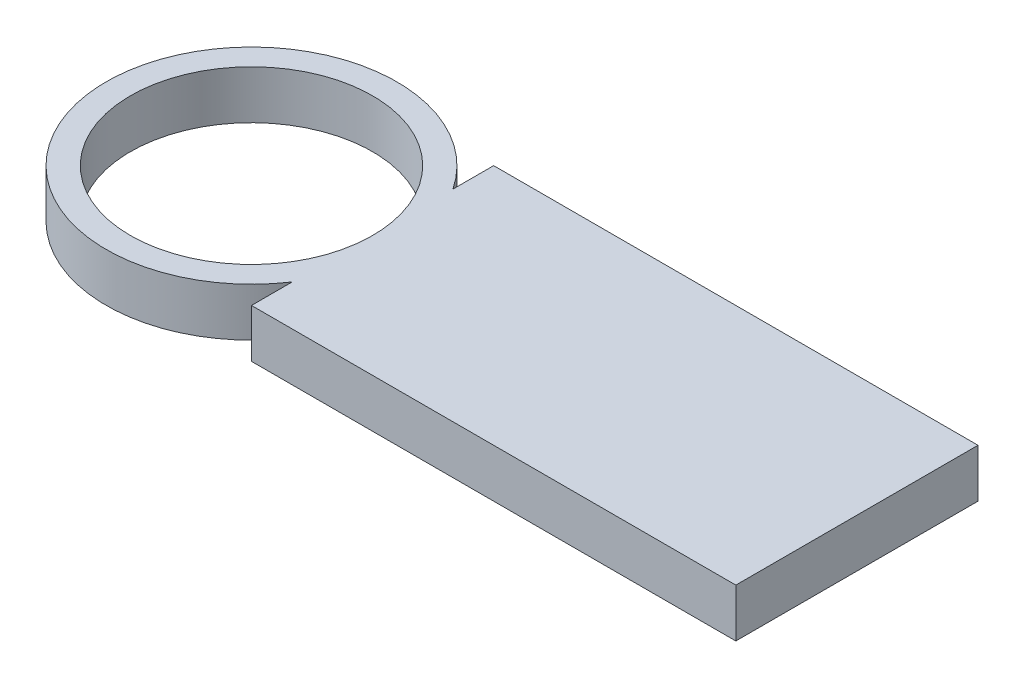
ISO-10303-21;
HEADER;
FILE_DESCRIPTION(('STEP AP214'),'2;1');
FILE_NAME('part.step','',(''),(''),'','','');
FILE_SCHEMA(('AUTOMOTIVE_DESIGN { 1 0 10303 214 1 1 1 1 }'));
ENDSEC;
DATA;
#1=APPLICATION_CONTEXT('core data for automotive mechanical design processes');
#2=APPLICATION_PROTOCOL_DEFINITION('international standard','automotive_design',2000,#1);
#3=PRODUCT_CONTEXT('',#1,'mechanical');
#4=PRODUCT('Part','Part','',(#3));
#5=PRODUCT_RELATED_PRODUCT_CATEGORY('part','',(#4));
#6=PRODUCT_DEFINITION_FORMATION('','',#4);
#7=PRODUCT_DEFINITION_CONTEXT('part definition',#1,'design');
#8=PRODUCT_DEFINITION('design','',#6,#7);
#9=PRODUCT_DEFINITION_SHAPE('','',#8);
#10=(LENGTH_UNIT() NAMED_UNIT(*) SI_UNIT(.MILLI.,.METRE.));
#11=(NAMED_UNIT(*) PLANE_ANGLE_UNIT() SI_UNIT($,.RADIAN.));
#12=(NAMED_UNIT(*) SI_UNIT($,.STERADIAN.) SOLID_ANGLE_UNIT());
#13=UNCERTAINTY_MEASURE_WITH_UNIT(LENGTH_MEASURE(1.E-05),#10,'distance_accuracy_value','');
#14=(GEOMETRIC_REPRESENTATION_CONTEXT(3) GLOBAL_UNCERTAINTY_ASSIGNED_CONTEXT((#13)) GLOBAL_UNIT_ASSIGNED_CONTEXT((#10,
#11,#12)) REPRESENTATION_CONTEXT('',''));
#15=CARTESIAN_POINT('',(0.,0.,0.));
#16=DIRECTION('',(0.,0.,1.));
#17=DIRECTION('',(1.,0.,0.));
#18=AXIS2_PLACEMENT_3D('',#15,#16,#17);
#19=CARTESIAN_POINT('',(0.,10.,0.));
#20=DIRECTION('',(0.,-1.,0.));
#21=DIRECTION('',(0.,0.,-1.));
#22=AXIS2_PLACEMENT_3D('',#19,#20,#21);
#23=CYLINDRICAL_SURFACE('',#22,30.);
#24=DIRECTION('',(0.,-1.,0.));
#25=VECTOR('',#24,1.);
#26=CARTESIAN_POINT('',(25.,10.,16.583123951777));
#27=LINE('',#26,#25);
#28=CARTESIAN_POINT('',(25.,10.,16.583123951777));
#29=VERTEX_POINT('',#28);
#30=CARTESIAN_POINT('',(25.,0.,16.583123951777));
#31=VERTEX_POINT('',#30);
#32=EDGE_CURVE('E106',#29,#31,#27,.T.);
#33=ORIENTED_EDGE('',*,*,#32,.F.);
#34=CARTESIAN_POINT('',(0.,10.,0.));
#35=DIRECTION('',(0.,1.,0.));
#36=DIRECTION('',(0.,0.,1.));
#37=AXIS2_PLACEMENT_3D('',#34,#35,#36);
#38=CIRCLE('',#37,30.);
#39=CARTESIAN_POINT('',(25.,10.,-16.583123951777));
#40=VERTEX_POINT('',#39);
#41=EDGE_CURVE('E11',#40,#29,#38,.T.);
#42=ORIENTED_EDGE('',*,*,#41,.F.);
#43=DIRECTION('',(0.,-1.,0.));
#44=VECTOR('',#43,1.);
#45=CARTESIAN_POINT('',(25.,10.,-16.583123951777));
#46=LINE('',#45,#44);
#47=CARTESIAN_POINT('',(25.,0.,-16.583123951777));
#48=VERTEX_POINT('',#47);
#49=EDGE_CURVE('E104',#48,#40,#46,.F.);
#50=ORIENTED_EDGE('',*,*,#49,.F.);
#51=CARTESIAN_POINT('',(0.,0.,0.));
#52=DIRECTION('',(0.,1.,0.));
#53=DIRECTION('',(0.,0.,1.));
#54=AXIS2_PLACEMENT_3D('',#51,#52,#53);
#55=CIRCLE('',#54,30.);
#56=EDGE_CURVE('E36',#48,#31,#55,.T.);
#57=ORIENTED_EDGE('',*,*,#56,.T.);
#58=EDGE_LOOP('',(#33,#42,#50,#57));
#59=FACE_BOUND('',#58,.T.);
#60=ADVANCED_FACE('F33',(#59),#23,.T.);
#61=CARTESIAN_POINT('',(0.,10.,0.));
#62=DIRECTION('',(0.,1.,0.));
#63=DIRECTION('',(0.,0.,1.));
#64=AXIS2_PLACEMENT_3D('',#61,#62,#63);
#65=PLANE('',#64);
#66=CARTESIAN_POINT('',(0.,10.,0.));
#67=DIRECTION('',(0.,1.,0.));
#68=DIRECTION('',(0.,0.,1.));
#69=AXIS2_PLACEMENT_3D('',#66,#67,#68);
#70=CIRCLE('',#69,25.);
#71=CARTESIAN_POINT('',(0.,10.,25.));
#72=VERTEX_POINT('',#71);
#73=EDGE_CURVE('E114',#72,#72,#70,.T.);
#74=ORIENTED_EDGE('',*,*,#73,.F.);
#75=EDGE_LOOP('',(#74));
#76=FACE_BOUND('',#75,.T.);
#77=ORIENTED_EDGE('',*,*,#41,.T.);
#78=DIRECTION('',(0.,0.,1.));
#79=VECTOR('',#78,1.);
#80=CARTESIAN_POINT('',(25.,10.,-25.));
#81=LINE('',#80,#79);
#82=CARTESIAN_POINT('',(25.,10.,25.));
#83=VERTEX_POINT('',#82);
#84=EDGE_CURVE('E80',#29,#83,#81,.T.);
#85=ORIENTED_EDGE('',*,*,#84,.T.);
#86=DIRECTION('',(1.,0.,0.));
#87=VECTOR('',#86,1.);
#88=CARTESIAN_POINT('',(125.,10.,25.));
#89=LINE('',#88,#87);
#90=CARTESIAN_POINT('',(125.,10.,25.));
#91=VERTEX_POINT('',#90);
#92=EDGE_CURVE('E83',#83,#91,#89,.T.);
#93=ORIENTED_EDGE('',*,*,#92,.T.);
#94=DIRECTION('',(0.,0.,-1.));
#95=VECTOR('',#94,1.);
#96=CARTESIAN_POINT('',(125.,10.,-25.));
#97=LINE('',#96,#95);
#98=CARTESIAN_POINT('',(125.,10.,-25.));
#99=VERTEX_POINT('',#98);
#100=EDGE_CURVE('E98',#91,#99,#97,.T.);
#101=ORIENTED_EDGE('',*,*,#100,.T.);
#102=DIRECTION('',(-1.,0.,0.));
#103=VECTOR('',#102,1.);
#104=CARTESIAN_POINT('',(125.,10.,-25.));
#105=LINE('',#104,#103);
#106=CARTESIAN_POINT('',(25.,10.,-25.));
#107=VERTEX_POINT('',#106);
#108=EDGE_CURVE('E165',#99,#107,#105,.T.);
#109=ORIENTED_EDGE('',*,*,#108,.T.);
#110=EDGE_CURVE('E88',#107,#40,#81,.T.);
#111=ORIENTED_EDGE('',*,*,#110,.T.);
#112=EDGE_LOOP('',(#77,#85,#93,#101,#109,#111));
#113=FACE_BOUND('',#112,.T.);
#114=ADVANCED_FACE('F82',(#76,#113),#65,.T.);
#115=CARTESIAN_POINT('',(0.,0.,0.));
#116=DIRECTION('',(0.,1.,0.));
#117=DIRECTION('',(0.,0.,1.));
#118=AXIS2_PLACEMENT_3D('',#115,#116,#117);
#119=PLANE('',#118);
#120=CARTESIAN_POINT('',(0.,0.,0.));
#121=DIRECTION('',(0.,1.,0.));
#122=DIRECTION('',(0.,0.,1.));
#123=AXIS2_PLACEMENT_3D('',#120,#121,#122);
#124=CIRCLE('',#123,25.);
#125=CARTESIAN_POINT('',(0.,0.,25.));
#126=VERTEX_POINT('',#125);
#127=EDGE_CURVE('E113',#126,#126,#124,.T.);
#128=ORIENTED_EDGE('',*,*,#127,.T.);
#129=EDGE_LOOP('',(#128));
#130=FACE_BOUND('',#129,.T.);
#131=DIRECTION('',(0.,0.,1.));
#132=VECTOR('',#131,1.);
#133=CARTESIAN_POINT('',(25.,0.,-25.));
#134=LINE('',#133,#132);
#135=CARTESIAN_POINT('',(25.,0.,25.));
#136=VERTEX_POINT('',#135);
#137=EDGE_CURVE('E102',#31,#136,#134,.T.);
#138=ORIENTED_EDGE('',*,*,#137,.F.);
#139=ORIENTED_EDGE('',*,*,#56,.F.);
#140=CARTESIAN_POINT('',(25.,0.,-25.));
#141=VERTEX_POINT('',#140);
#142=EDGE_CURVE('E164',#141,#48,#134,.T.);
#143=ORIENTED_EDGE('',*,*,#142,.F.);
#144=DIRECTION('',(-1.,0.,0.));
#145=VECTOR('',#144,1.);
#146=CARTESIAN_POINT('',(125.,0.,-25.));
#147=LINE('',#146,#145);
#148=CARTESIAN_POINT('',(125.,0.,-25.));
#149=VERTEX_POINT('',#148);
#150=EDGE_CURVE('E89',#149,#141,#147,.T.);
#151=ORIENTED_EDGE('',*,*,#150,.F.);
#152=DIRECTION('',(0.,0.,-1.));
#153=VECTOR('',#152,1.);
#154=CARTESIAN_POINT('',(125.,0.,-25.));
#155=LINE('',#154,#153);
#156=CARTESIAN_POINT('',(125.,0.,25.));
#157=VERTEX_POINT('',#156);
#158=EDGE_CURVE('E160',#157,#149,#155,.T.);
#159=ORIENTED_EDGE('',*,*,#158,.F.);
#160=DIRECTION('',(1.,0.,0.));
#161=VECTOR('',#160,1.);
#162=CARTESIAN_POINT('',(125.,0.,25.));
#163=LINE('',#162,#161);
#164=EDGE_CURVE('E167',#136,#157,#163,.T.);
#165=ORIENTED_EDGE('',*,*,#164,.F.);
#166=EDGE_LOOP('',(#138,#139,#143,#151,#159,#165));
#167=FACE_BOUND('',#166,.T.);
#168=ADVANCED_FACE('F120',(#130,#167),#119,.F.);
#169=CARTESIAN_POINT('',(0.,10.,0.));
#170=DIRECTION('',(0.,-1.,0.));
#171=DIRECTION('',(0.,0.,-1.));
#172=AXIS2_PLACEMENT_3D('',#169,#170,#171);
#173=CYLINDRICAL_SURFACE('',#172,25.);
#174=ORIENTED_EDGE('',*,*,#127,.F.);
#175=EDGE_LOOP('',(#174));
#176=FACE_BOUND('',#175,.T.);
#177=ORIENTED_EDGE('',*,*,#73,.T.);
#178=EDGE_LOOP('',(#177));
#179=FACE_BOUND('',#178,.T.);
#180=ADVANCED_FACE('F123',(#176,#179),#173,.F.);
#181=CARTESIAN_POINT('',(25.,10.,-25.));
#182=DIRECTION('',(1.,0.,0.));
#183=DIRECTION('',(0.,0.,-1.));
#184=AXIS2_PLACEMENT_3D('',#181,#182,#183);
#185=PLANE('',#184);
#186=ORIENTED_EDGE('',*,*,#84,.F.);
#187=ORIENTED_EDGE('',*,*,#32,.T.);
#188=ORIENTED_EDGE('',*,*,#137,.T.);
#189=DIRECTION('',(0.,-1.,0.));
#190=VECTOR('',#189,1.);
#191=CARTESIAN_POINT('',(25.,10.,25.));
#192=LINE('',#191,#190);
#193=EDGE_CURVE('E94',#83,#136,#192,.T.);
#194=ORIENTED_EDGE('',*,*,#193,.F.);
#195=EDGE_LOOP('',(#186,#187,#188,#194));
#196=FACE_BOUND('',#195,.T.);
#197=ADVANCED_FACE('F100',(#196),#185,.F.);
#198=ORIENTED_EDGE('',*,*,#142,.T.);
#199=ORIENTED_EDGE('',*,*,#49,.T.);
#200=ORIENTED_EDGE('',*,*,#110,.F.);
#201=DIRECTION('',(0.,-1.,0.));
#202=VECTOR('',#201,1.);
#203=CARTESIAN_POINT('',(25.,10.,-25.));
#204=LINE('',#203,#202);
#205=EDGE_CURVE('E155',#107,#141,#204,.T.);
#206=ORIENTED_EDGE('',*,*,#205,.T.);
#207=EDGE_LOOP('',(#198,#199,#200,#206));
#208=FACE_BOUND('',#207,.T.);
#209=ADVANCED_FACE('F138',(#208),#185,.F.);
#210=CARTESIAN_POINT('',(125.,10.,25.));
#211=DIRECTION('',(0.,0.,-1.));
#212=DIRECTION('',(-1.,0.,0.));
#213=AXIS2_PLACEMENT_3D('',#210,#211,#212);
#214=PLANE('',#213);
#215=ORIENTED_EDGE('',*,*,#164,.T.);
#216=DIRECTION('',(0.,-1.,0.));
#217=VECTOR('',#216,1.);
#218=CARTESIAN_POINT('',(125.,10.,25.));
#219=LINE('',#218,#217);
#220=EDGE_CURVE('E96',#91,#157,#219,.T.);
#221=ORIENTED_EDGE('',*,*,#220,.F.);
#222=ORIENTED_EDGE('',*,*,#92,.F.);
#223=ORIENTED_EDGE('',*,*,#193,.T.);
#224=EDGE_LOOP('',(#215,#221,#222,#223));
#225=FACE_BOUND('',#224,.T.);
#226=ADVANCED_FACE('F93',(#225),#214,.F.);
#227=CARTESIAN_POINT('',(125.,10.,-25.));
#228=DIRECTION('',(-1.,0.,0.));
#229=DIRECTION('',(0.,0.,1.));
#230=AXIS2_PLACEMENT_3D('',#227,#228,#229);
#231=PLANE('',#230);
#232=ORIENTED_EDGE('',*,*,#158,.T.);
#233=DIRECTION('',(0.,-1.,0.));
#234=VECTOR('',#233,1.);
#235=CARTESIAN_POINT('',(125.,10.,-25.));
#236=LINE('',#235,#234);
#237=EDGE_CURVE('E108',#99,#149,#236,.T.);
#238=ORIENTED_EDGE('',*,*,#237,.F.);
#239=ORIENTED_EDGE('',*,*,#100,.F.);
#240=ORIENTED_EDGE('',*,*,#220,.T.);
#241=EDGE_LOOP('',(#232,#238,#239,#240));
#242=FACE_BOUND('',#241,.T.);
#243=ADVANCED_FACE('F141',(#242),#231,.F.);
#244=CARTESIAN_POINT('',(125.,10.,-25.));
#245=DIRECTION('',(0.,0.,1.));
#246=DIRECTION('',(1.,0.,0.));
#247=AXIS2_PLACEMENT_3D('',#244,#245,#246);
#248=PLANE('',#247);
#249=ORIENTED_EDGE('',*,*,#150,.T.);
#250=ORIENTED_EDGE('',*,*,#205,.F.);
#251=ORIENTED_EDGE('',*,*,#108,.F.);
#252=ORIENTED_EDGE('',*,*,#237,.T.);
#253=EDGE_LOOP('',(#249,#250,#251,#252));
#254=FACE_BOUND('',#253,.T.);
#255=ADVANCED_FACE('F144',(#254),#248,.F.);
#256=CLOSED_SHELL('',(#60,#114,#168,#180,#197,#209,#226,#243,#255));
#257=MANIFOLD_SOLID_BREP('B2',#256);
#258=ADVANCED_BREP_SHAPE_REPRESENTATION('',(#18,#257),#14);
#259=SHAPE_DEFINITION_REPRESENTATION(#9,#258);
ENDSEC;
END-ISO-10303-21;
